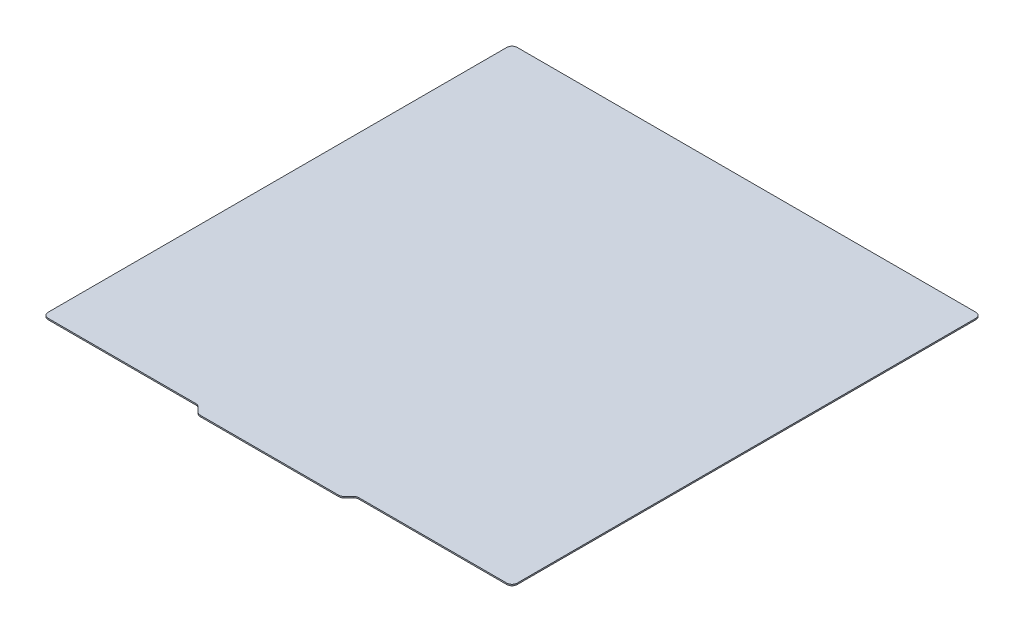
ISO-10303-21;
HEADER;
FILE_DESCRIPTION(('STEP AP214'),'2;1');
FILE_NAME('part.step','',(''),(''),'','','');
FILE_SCHEMA(('AUTOMOTIVE_DESIGN { 1 0 10303 214 1 1 1 1 }'));
ENDSEC;
DATA;
#1=APPLICATION_CONTEXT('core data for automotive mechanical design processes');
#2=APPLICATION_PROTOCOL_DEFINITION('international standard','automotive_design',2000,#1);
#3=PRODUCT_CONTEXT('',#1,'mechanical');
#4=PRODUCT('Part','Part','',(#3));
#5=PRODUCT_RELATED_PRODUCT_CATEGORY('part','',(#4));
#6=PRODUCT_DEFINITION_FORMATION('','',#4);
#7=PRODUCT_DEFINITION_CONTEXT('part definition',#1,'design');
#8=PRODUCT_DEFINITION('design','',#6,#7);
#9=PRODUCT_DEFINITION_SHAPE('','',#8);
#10=(LENGTH_UNIT() NAMED_UNIT(*) SI_UNIT(.MILLI.,.METRE.));
#11=(NAMED_UNIT(*) PLANE_ANGLE_UNIT() SI_UNIT($,.RADIAN.));
#12=(NAMED_UNIT(*) SI_UNIT($,.STERADIAN.) SOLID_ANGLE_UNIT());
#13=UNCERTAINTY_MEASURE_WITH_UNIT(LENGTH_MEASURE(1.E-05),#10,'distance_accuracy_value','');
#14=(GEOMETRIC_REPRESENTATION_CONTEXT(3) GLOBAL_UNCERTAINTY_ASSIGNED_CONTEXT((#13)) GLOBAL_UNIT_ASSIGNED_CONTEXT((#10,
#11,#12)) REPRESENTATION_CONTEXT('',''));
#15=CARTESIAN_POINT('',(0.,0.,0.));
#16=DIRECTION('',(0.,0.,1.));
#17=DIRECTION('',(1.,0.,0.));
#18=AXIS2_PLACEMENT_3D('',#15,#16,#17);
#19=CARTESIAN_POINT('',(60.,1.,177.5));
#20=DIRECTION('',(0.,0.,-1.));
#21=DIRECTION('',(-1.,0.,0.));
#22=AXIS2_PLACEMENT_3D('',#19,#20,#21);
#23=PLANE('',#22);
#24=DIRECTION('',(1.,0.,0.));
#25=VECTOR('',#24,1.);
#26=CARTESIAN_POINT('',(60.,1.,177.5));
#27=LINE('',#26,#25);
#28=CARTESIAN_POINT('',(61.6568542494924,1.,177.5));
#29=VERTEX_POINT('',#28);
#30=CARTESIAN_POINT('',(173.5,1.,177.5));
#31=VERTEX_POINT('',#30);
#32=EDGE_CURVE('E203',#29,#31,#27,.T.);
#33=ORIENTED_EDGE('',*,*,#32,.F.);
#34=DIRECTION('',(0.,-1.,0.));
#35=VECTOR('',#34,1.);
#36=CARTESIAN_POINT('',(61.6568542494924,0.,177.5));
#37=LINE('',#36,#35);
#38=CARTESIAN_POINT('',(61.6568542494924,0.,177.5));
#39=VERTEX_POINT('',#38);
#40=EDGE_CURVE('E254',#29,#39,#37,.T.);
#41=ORIENTED_EDGE('',*,*,#40,.T.);
#42=DIRECTION('',(1.,0.,0.));
#43=VECTOR('',#42,1.);
#44=CARTESIAN_POINT('',(60.,0.,177.5));
#45=LINE('',#44,#43);
#46=CARTESIAN_POINT('',(173.5,0.,177.5));
#47=VERTEX_POINT('',#46);
#48=EDGE_CURVE('E189',#39,#47,#45,.T.);
#49=ORIENTED_EDGE('',*,*,#48,.T.);
#50=DIRECTION('',(0.,-1.,0.));
#51=VECTOR('',#50,1.);
#52=CARTESIAN_POINT('',(173.5,1.,177.5));
#53=LINE('',#52,#51);
#54=EDGE_CURVE('E252',#47,#31,#53,.F.);
#55=ORIENTED_EDGE('',*,*,#54,.T.);
#56=EDGE_LOOP('',(#33,#41,#49,#55));
#57=FACE_BOUND('',#56,.T.);
#58=ADVANCED_FACE('F43',(#57),#23,.F.);
#59=CARTESIAN_POINT('',(177.5,1.,-177.5));
#60=DIRECTION('',(-1.,0.,0.));
#61=DIRECTION('',(0.,0.,1.));
#62=AXIS2_PLACEMENT_3D('',#59,#60,#61);
#63=PLANE('',#62);
#64=DIRECTION('',(0.,0.,-1.));
#65=VECTOR('',#64,1.);
#66=CARTESIAN_POINT('',(177.5,0.,-177.5));
#67=LINE('',#66,#65);
#68=CARTESIAN_POINT('',(177.5,0.,173.5));
#69=VERTEX_POINT('',#68);
#70=CARTESIAN_POINT('',(177.5,0.,-173.5));
#71=VERTEX_POINT('',#70);
#72=EDGE_CURVE('E184',#69,#71,#67,.T.);
#73=ORIENTED_EDGE('',*,*,#72,.T.);
#74=DIRECTION('',(0.,-1.,0.));
#75=VECTOR('',#74,1.);
#76=CARTESIAN_POINT('',(177.5,1.,-173.5));
#77=LINE('',#76,#75);
#78=CARTESIAN_POINT('',(177.5,1.,-173.5));
#79=VERTEX_POINT('',#78);
#80=EDGE_CURVE('E162',#71,#79,#77,.F.);
#81=ORIENTED_EDGE('',*,*,#80,.T.);
#82=DIRECTION('',(0.,0.,-1.));
#83=VECTOR('',#82,1.);
#84=CARTESIAN_POINT('',(177.5,1.,-177.5));
#85=LINE('',#84,#83);
#86=CARTESIAN_POINT('',(177.5,1.,173.5));
#87=VERTEX_POINT('',#86);
#88=EDGE_CURVE('E276',#87,#79,#85,.T.);
#89=ORIENTED_EDGE('',*,*,#88,.F.);
#90=DIRECTION('',(0.,-1.,0.));
#91=VECTOR('',#90,1.);
#92=CARTESIAN_POINT('',(177.5,1.,173.5));
#93=LINE('',#92,#91);
#94=EDGE_CURVE('E167',#87,#69,#93,.T.);
#95=ORIENTED_EDGE('',*,*,#94,.T.);
#96=EDGE_LOOP('',(#73,#81,#89,#95));
#97=FACE_BOUND('',#96,.T.);
#98=ADVANCED_FACE('F296',(#97),#63,.F.);
#99=CARTESIAN_POINT('',(-177.5,1.,-177.5));
#100=DIRECTION('',(0.,0.,1.));
#101=DIRECTION('',(1.,0.,0.));
#102=AXIS2_PLACEMENT_3D('',#99,#100,#101);
#103=PLANE('',#102);
#104=DIRECTION('',(-1.,0.,0.));
#105=VECTOR('',#104,1.);
#106=CARTESIAN_POINT('',(-177.5,1.,-177.5));
#107=LINE('',#106,#105);
#108=CARTESIAN_POINT('',(173.5,1.,-177.5));
#109=VERTEX_POINT('',#108);
#110=CARTESIAN_POINT('',(-173.5,1.,-177.5));
#111=VERTEX_POINT('',#110);
#112=EDGE_CURVE('E177',#109,#111,#107,.T.);
#113=ORIENTED_EDGE('',*,*,#112,.F.);
#114=DIRECTION('',(0.,-1.,0.));
#115=VECTOR('',#114,1.);
#116=CARTESIAN_POINT('',(173.5,1.,-177.5));
#117=LINE('',#116,#115);
#118=CARTESIAN_POINT('',(173.5,0.,-177.5));
#119=VERTEX_POINT('',#118);
#120=EDGE_CURVE('E161',#109,#119,#117,.T.);
#121=ORIENTED_EDGE('',*,*,#120,.T.);
#122=DIRECTION('',(-1.,0.,0.));
#123=VECTOR('',#122,1.);
#124=CARTESIAN_POINT('',(-177.5,0.,-177.5));
#125=LINE('',#124,#123);
#126=CARTESIAN_POINT('',(-173.5,0.,-177.5));
#127=VERTEX_POINT('',#126);
#128=EDGE_CURVE('E174',#119,#127,#125,.T.);
#129=ORIENTED_EDGE('',*,*,#128,.T.);
#130=DIRECTION('',(0.,-1.,0.));
#131=VECTOR('',#130,1.);
#132=CARTESIAN_POINT('',(-173.5,1.,-177.5));
#133=LINE('',#132,#131);
#134=EDGE_CURVE('E179',#127,#111,#133,.F.);
#135=ORIENTED_EDGE('',*,*,#134,.T.);
#136=EDGE_LOOP('',(#113,#121,#129,#135));
#137=FACE_BOUND('',#136,.T.);
#138=ADVANCED_FACE('F173',(#137),#103,.F.);
#139=CARTESIAN_POINT('',(-177.5,1.,-177.5));
#140=DIRECTION('',(1.,0.,0.));
#141=DIRECTION('',(0.,0.,-1.));
#142=AXIS2_PLACEMENT_3D('',#139,#140,#141);
#143=PLANE('',#142);
#144=DIRECTION('',(0.,0.,1.));
#145=VECTOR('',#144,1.);
#146=CARTESIAN_POINT('',(-177.5,1.,-177.5));
#147=LINE('',#146,#145);
#148=CARTESIAN_POINT('',(-177.5,1.,-173.5));
#149=VERTEX_POINT('',#148);
#150=CARTESIAN_POINT('',(-177.5,1.,173.5));
#151=VERTEX_POINT('',#150);
#152=EDGE_CURVE('E281',#149,#151,#147,.T.);
#153=ORIENTED_EDGE('',*,*,#152,.F.);
#154=DIRECTION('',(0.,-1.,0.));
#155=VECTOR('',#154,1.);
#156=CARTESIAN_POINT('',(-177.5,1.,-173.5));
#157=LINE('',#156,#155);
#158=CARTESIAN_POINT('',(-177.5,0.,-173.5));
#159=VERTEX_POINT('',#158);
#160=EDGE_CURVE('E230',#149,#159,#157,.T.);
#161=ORIENTED_EDGE('',*,*,#160,.T.);
#162=DIRECTION('',(0.,0.,1.));
#163=VECTOR('',#162,1.);
#164=CARTESIAN_POINT('',(-177.5,0.,-177.5));
#165=LINE('',#164,#163);
#166=CARTESIAN_POINT('',(-177.5,0.,173.5));
#167=VERTEX_POINT('',#166);
#168=EDGE_CURVE('E183',#159,#167,#165,.T.);
#169=ORIENTED_EDGE('',*,*,#168,.T.);
#170=DIRECTION('',(0.,-1.,0.));
#171=VECTOR('',#170,1.);
#172=CARTESIAN_POINT('',(-177.5,1.,173.5));
#173=LINE('',#172,#171);
#174=EDGE_CURVE('E228',#167,#151,#173,.F.);
#175=ORIENTED_EDGE('',*,*,#174,.T.);
#176=EDGE_LOOP('',(#153,#161,#169,#175));
#177=FACE_BOUND('',#176,.T.);
#178=ADVANCED_FACE('F303',(#177),#143,.F.);
#179=CARTESIAN_POINT('',(-177.5,1.,177.5));
#180=DIRECTION('',(0.,0.,-1.));
#181=DIRECTION('',(-1.,0.,0.));
#182=AXIS2_PLACEMENT_3D('',#179,#180,#181);
#183=PLANE('',#182);
#184=DIRECTION('',(1.,0.,0.));
#185=VECTOR('',#184,1.);
#186=CARTESIAN_POINT('',(-177.5,1.,177.5));
#187=LINE('',#186,#185);
#188=CARTESIAN_POINT('',(-173.5,1.,177.5));
#189=VERTEX_POINT('',#188);
#190=CARTESIAN_POINT('',(-61.6568542494924,1.,177.5));
#191=VERTEX_POINT('',#190);
#192=EDGE_CURVE('E284',#189,#191,#187,.T.);
#193=ORIENTED_EDGE('',*,*,#192,.F.);
#194=DIRECTION('',(0.,-1.,0.));
#195=VECTOR('',#194,1.);
#196=CARTESIAN_POINT('',(-173.5,1.,177.5));
#197=LINE('',#196,#195);
#198=CARTESIAN_POINT('',(-173.5,0.,177.5));
#199=VERTEX_POINT('',#198);
#200=EDGE_CURVE('E235',#189,#199,#197,.T.);
#201=ORIENTED_EDGE('',*,*,#200,.T.);
#202=DIRECTION('',(1.,0.,0.));
#203=VECTOR('',#202,1.);
#204=CARTESIAN_POINT('',(-177.5,0.,177.5));
#205=LINE('',#204,#203);
#206=CARTESIAN_POINT('',(-61.6568542494924,0.,177.5));
#207=VERTEX_POINT('',#206);
#208=EDGE_CURVE('E187',#199,#207,#205,.T.);
#209=ORIENTED_EDGE('',*,*,#208,.T.);
#210=DIRECTION('',(0.,-1.,0.));
#211=VECTOR('',#210,1.);
#212=CARTESIAN_POINT('',(-61.6568542494924,1.,177.5));
#213=LINE('',#212,#211);
#214=EDGE_CURVE('E233',#207,#191,#213,.F.);
#215=ORIENTED_EDGE('',*,*,#214,.T.);
#216=EDGE_LOOP('',(#193,#201,#209,#215));
#217=FACE_BOUND('',#216,.T.);
#218=ADVANCED_FACE('F422',(#217),#183,.F.);
#219=CARTESIAN_POINT('',(-60.,1.,177.5));
#220=DIRECTION('',(0.707106781186548,0.,-0.707106781186547));
#221=DIRECTION('',(-0.707106781186547,0.,-0.707106781186548));
#222=AXIS2_PLACEMENT_3D('',#219,#220,#221);
#223=PLANE('',#222);
#224=DIRECTION('',(0.707106781186547,0.,0.707106781186548));
#225=VECTOR('',#224,1.);
#226=CARTESIAN_POINT('',(-60.,0.,177.5));
#227=LINE('',#226,#225);
#228=CARTESIAN_POINT('',(-58.8284271247462,0.,178.671572875254));
#229=VERTEX_POINT('',#228);
#230=CARTESIAN_POINT('',(-55.1715728752538,0.,182.328427124746));
#231=VERTEX_POINT('',#230);
#232=EDGE_CURVE('E195',#229,#231,#227,.T.);
#233=ORIENTED_EDGE('',*,*,#232,.T.);
#234=DIRECTION('',(0.,-1.,0.));
#235=VECTOR('',#234,1.);
#236=CARTESIAN_POINT('',(-55.1715728752538,1.,182.328427124746));
#237=LINE('',#236,#235);
#238=CARTESIAN_POINT('',(-55.1715728752538,1.,182.328427124746));
#239=VERTEX_POINT('',#238);
#240=EDGE_CURVE('E246',#231,#239,#237,.F.);
#241=ORIENTED_EDGE('',*,*,#240,.T.);
#242=DIRECTION('',(0.707106781186547,0.,0.707106781186548));
#243=VECTOR('',#242,1.);
#244=CARTESIAN_POINT('',(-60.,1.,177.5));
#245=LINE('',#244,#243);
#246=CARTESIAN_POINT('',(-58.8284271247462,1.,178.671572875254));
#247=VERTEX_POINT('',#246);
#248=EDGE_CURVE('E287',#247,#239,#245,.T.);
#249=ORIENTED_EDGE('',*,*,#248,.F.);
#250=DIRECTION('',(0.,-1.,0.));
#251=VECTOR('',#250,1.);
#252=CARTESIAN_POINT('',(-58.8284271247462,0.,178.671572875254));
#253=LINE('',#252,#251);
#254=EDGE_CURVE('E243',#247,#229,#253,.T.);
#255=ORIENTED_EDGE('',*,*,#254,.T.);
#256=EDGE_LOOP('',(#233,#241,#249,#255));
#257=FACE_BOUND('',#256,.T.);
#258=ADVANCED_FACE('F412',(#257),#223,.F.);
#259=CARTESIAN_POINT('',(-54.,1.,183.5));
#260=DIRECTION('',(0.,0.,-1.));
#261=DIRECTION('',(-1.,0.,0.));
#262=AXIS2_PLACEMENT_3D('',#259,#260,#261);
#263=PLANE('',#262);
#264=DIRECTION('',(1.,0.,0.));
#265=VECTOR('',#264,1.);
#266=CARTESIAN_POINT('',(-54.,1.,183.5));
#267=LINE('',#266,#265);
#268=CARTESIAN_POINT('',(-52.3431457505076,1.,183.5));
#269=VERTEX_POINT('',#268);
#270=CARTESIAN_POINT('',(52.3431457505076,1.,183.5));
#271=VERTEX_POINT('',#270);
#272=EDGE_CURVE('E290',#269,#271,#267,.T.);
#273=ORIENTED_EDGE('',*,*,#272,.F.);
#274=DIRECTION('',(0.,-1.,0.));
#275=VECTOR('',#274,1.);
#276=CARTESIAN_POINT('',(-52.3431457505076,1.,183.5));
#277=LINE('',#276,#275);
#278=CARTESIAN_POINT('',(-52.3431457505076,0.,183.5));
#279=VERTEX_POINT('',#278);
#280=EDGE_CURVE('E240',#269,#279,#277,.T.);
#281=ORIENTED_EDGE('',*,*,#280,.T.);
#282=DIRECTION('',(1.,0.,0.));
#283=VECTOR('',#282,1.);
#284=CARTESIAN_POINT('',(-54.,0.,183.5));
#285=LINE('',#284,#283);
#286=CARTESIAN_POINT('',(52.3431457505076,0.,183.5));
#287=VERTEX_POINT('',#286);
#288=EDGE_CURVE('E198',#279,#287,#285,.T.);
#289=ORIENTED_EDGE('',*,*,#288,.T.);
#290=DIRECTION('',(0.,-1.,0.));
#291=VECTOR('',#290,1.);
#292=CARTESIAN_POINT('',(52.3431457505076,1.,183.5));
#293=LINE('',#292,#291);
#294=EDGE_CURVE('E238',#287,#271,#293,.F.);
#295=ORIENTED_EDGE('',*,*,#294,.T.);
#296=EDGE_LOOP('',(#273,#281,#289,#295));
#297=FACE_BOUND('',#296,.T.);
#298=ADVANCED_FACE('F403',(#297),#263,.F.);
#299=CARTESIAN_POINT('',(54.,1.,183.5));
#300=DIRECTION('',(-0.707106781186548,0.,-0.707106781186547));
#301=DIRECTION('',(-0.707106781186547,0.,0.707106781186548));
#302=AXIS2_PLACEMENT_3D('',#299,#300,#301);
#303=PLANE('',#302);
#304=DIRECTION('',(0.707106781186547,0.,-0.707106781186548));
#305=VECTOR('',#304,1.);
#306=CARTESIAN_POINT('',(54.,1.,183.5));
#307=LINE('',#306,#305);
#308=CARTESIAN_POINT('',(55.1715728752538,1.,182.328427124746));
#309=VERTEX_POINT('',#308);
#310=CARTESIAN_POINT('',(58.8284271247462,1.,178.671572875254));
#311=VERTEX_POINT('',#310);
#312=EDGE_CURVE('E204',#309,#311,#307,.T.);
#313=ORIENTED_EDGE('',*,*,#312,.F.);
#314=DIRECTION('',(0.,-1.,0.));
#315=VECTOR('',#314,1.);
#316=CARTESIAN_POINT('',(55.1715728752538,1.,182.328427124746));
#317=LINE('',#316,#315);
#318=CARTESIAN_POINT('',(55.1715728752538,0.,182.328427124746));
#319=VERTEX_POINT('',#318);
#320=EDGE_CURVE('E249',#309,#319,#317,.T.);
#321=ORIENTED_EDGE('',*,*,#320,.T.);
#322=DIRECTION('',(0.707106781186547,0.,-0.707106781186548));
#323=VECTOR('',#322,1.);
#324=CARTESIAN_POINT('',(54.,0.,183.5));
#325=LINE('',#324,#323);
#326=CARTESIAN_POINT('',(58.8284271247462,0.,178.671572875254));
#327=VERTEX_POINT('',#326);
#328=EDGE_CURVE('E201',#319,#327,#325,.T.);
#329=ORIENTED_EDGE('',*,*,#328,.T.);
#330=DIRECTION('',(0.,-1.,0.));
#331=VECTOR('',#330,1.);
#332=CARTESIAN_POINT('',(58.8284271247462,1.,178.671572875254));
#333=LINE('',#332,#331);
#334=EDGE_CURVE('E58',#327,#311,#333,.F.);
#335=ORIENTED_EDGE('',*,*,#334,.T.);
#336=EDGE_LOOP('',(#313,#321,#329,#335));
#337=FACE_BOUND('',#336,.T.);
#338=ADVANCED_FACE('F265',(#337),#303,.F.);
#339=CARTESIAN_POINT('',(0.,1.,0.));
#340=DIRECTION('',(0.,-1.,0.));
#341=DIRECTION('',(0.,0.,-1.));
#342=AXIS2_PLACEMENT_3D('',#339,#340,#341);
#343=PLANE('',#342);
#344=ORIENTED_EDGE('',*,*,#88,.T.);
#345=CARTESIAN_POINT('',(173.5,1.,-173.5));
#346=DIRECTION('',(0.,-1.,0.));
#347=DIRECTION('',(0.,0.,-1.));
#348=AXIS2_PLACEMENT_3D('',#345,#346,#347);
#349=CIRCLE('',#348,4.);
#350=EDGE_CURVE('E226',#79,#109,#349,.F.);
#351=ORIENTED_EDGE('',*,*,#350,.T.);
#352=ORIENTED_EDGE('',*,*,#112,.T.);
#353=CARTESIAN_POINT('',(-173.5,1.,-173.5));
#354=DIRECTION('',(0.,-1.,0.));
#355=DIRECTION('',(0.,0.,-1.));
#356=AXIS2_PLACEMENT_3D('',#353,#354,#355);
#357=CIRCLE('',#356,4.);
#358=EDGE_CURVE('E224',#111,#149,#357,.F.);
#359=ORIENTED_EDGE('',*,*,#358,.T.);
#360=ORIENTED_EDGE('',*,*,#152,.T.);
#361=CARTESIAN_POINT('',(-173.5,1.,173.5));
#362=DIRECTION('',(0.,-1.,0.));
#363=DIRECTION('',(0.,0.,-1.));
#364=AXIS2_PLACEMENT_3D('',#361,#362,#363);
#365=CIRCLE('',#364,4.);
#366=EDGE_CURVE('E222',#151,#189,#365,.F.);
#367=ORIENTED_EDGE('',*,*,#366,.T.);
#368=ORIENTED_EDGE('',*,*,#192,.T.);
#369=CARTESIAN_POINT('',(-61.6568542494924,1.,181.5));
#370=DIRECTION('',(0.,-1.,0.));
#371=DIRECTION('',(0.,0.,-1.));
#372=AXIS2_PLACEMENT_3D('',#369,#370,#371);
#373=CIRCLE('',#372,4.);
#374=EDGE_CURVE('E259',#191,#247,#373,.T.);
#375=ORIENTED_EDGE('',*,*,#374,.T.);
#376=ORIENTED_EDGE('',*,*,#248,.T.);
#377=CARTESIAN_POINT('',(-52.3431457505076,1.,179.5));
#378=DIRECTION('',(0.,-1.,0.));
#379=DIRECTION('',(0.,0.,-1.));
#380=AXIS2_PLACEMENT_3D('',#377,#378,#379);
#381=CIRCLE('',#380,4.);
#382=EDGE_CURVE('E220',#239,#269,#381,.F.);
#383=ORIENTED_EDGE('',*,*,#382,.T.);
#384=ORIENTED_EDGE('',*,*,#272,.T.);
#385=CARTESIAN_POINT('',(52.3431457505076,1.,179.5));
#386=DIRECTION('',(0.,-1.,0.));
#387=DIRECTION('',(0.,0.,-1.));
#388=AXIS2_PLACEMENT_3D('',#385,#386,#387);
#389=CIRCLE('',#388,4.);
#390=EDGE_CURVE('E65',#271,#309,#389,.F.);
#391=ORIENTED_EDGE('',*,*,#390,.T.);
#392=ORIENTED_EDGE('',*,*,#312,.T.);
#393=CARTESIAN_POINT('',(61.6568542494924,1.,181.5));
#394=DIRECTION('',(0.,-1.,0.));
#395=DIRECTION('',(0.,0.,-1.));
#396=AXIS2_PLACEMENT_3D('',#393,#394,#395);
#397=CIRCLE('',#396,4.);
#398=EDGE_CURVE('E11',#311,#29,#397,.T.);
#399=ORIENTED_EDGE('',*,*,#398,.T.);
#400=ORIENTED_EDGE('',*,*,#32,.T.);
#401=CARTESIAN_POINT('',(173.5,1.,173.5));
#402=DIRECTION('',(0.,-1.,0.));
#403=DIRECTION('',(0.,0.,-1.));
#404=AXIS2_PLACEMENT_3D('',#401,#402,#403);
#405=CIRCLE('',#404,4.);
#406=EDGE_CURVE('E217',#31,#87,#405,.F.);
#407=ORIENTED_EDGE('',*,*,#406,.T.);
#408=EDGE_LOOP('',(#344,#351,#352,#359,#360,#367,#368,#375,#376,#383,#384,#391,#392,#399,#400,#407));
#409=FACE_BOUND('',#408,.T.);
#410=ADVANCED_FACE('F272',(#409),#343,.F.);
#411=CARTESIAN_POINT('',(0.,0.,0.));
#412=DIRECTION('',(0.,-1.,0.));
#413=DIRECTION('',(0.,0.,-1.));
#414=AXIS2_PLACEMENT_3D('',#411,#412,#413);
#415=PLANE('',#414);
#416=ORIENTED_EDGE('',*,*,#128,.F.);
#417=CARTESIAN_POINT('',(173.5,0.,-173.5));
#418=DIRECTION('',(0.,-1.,0.));
#419=DIRECTION('',(0.,0.,-1.));
#420=AXIS2_PLACEMENT_3D('',#417,#418,#419);
#421=CIRCLE('',#420,4.);
#422=EDGE_CURVE('E157',#119,#71,#421,.T.);
#423=ORIENTED_EDGE('',*,*,#422,.T.);
#424=ORIENTED_EDGE('',*,*,#72,.F.);
#425=CARTESIAN_POINT('',(173.5,0.,173.5));
#426=DIRECTION('',(0.,-1.,0.));
#427=DIRECTION('',(0.,0.,-1.));
#428=AXIS2_PLACEMENT_3D('',#425,#426,#427);
#429=CIRCLE('',#428,4.);
#430=EDGE_CURVE('E178',#69,#47,#429,.T.);
#431=ORIENTED_EDGE('',*,*,#430,.T.);
#432=ORIENTED_EDGE('',*,*,#48,.F.);
#433=CARTESIAN_POINT('',(61.6568542494924,0.,181.5));
#434=DIRECTION('',(0.,-1.,0.));
#435=DIRECTION('',(0.,0.,-1.));
#436=AXIS2_PLACEMENT_3D('',#433,#434,#435);
#437=CIRCLE('',#436,4.);
#438=EDGE_CURVE('E51',#39,#327,#437,.F.);
#439=ORIENTED_EDGE('',*,*,#438,.T.);
#440=ORIENTED_EDGE('',*,*,#328,.F.);
#441=CARTESIAN_POINT('',(52.3431457505076,0.,179.5));
#442=DIRECTION('',(0.,-1.,0.));
#443=DIRECTION('',(0.,0.,-1.));
#444=AXIS2_PLACEMENT_3D('',#441,#442,#443);
#445=CIRCLE('',#444,4.);
#446=EDGE_CURVE('E207',#319,#287,#445,.T.);
#447=ORIENTED_EDGE('',*,*,#446,.T.);
#448=ORIENTED_EDGE('',*,*,#288,.F.);
#449=CARTESIAN_POINT('',(-52.3431457505076,0.,179.5));
#450=DIRECTION('',(0.,-1.,0.));
#451=DIRECTION('',(0.,0.,-1.));
#452=AXIS2_PLACEMENT_3D('',#449,#450,#451);
#453=CIRCLE('',#452,4.);
#454=EDGE_CURVE('E209',#279,#231,#453,.T.);
#455=ORIENTED_EDGE('',*,*,#454,.T.);
#456=ORIENTED_EDGE('',*,*,#232,.F.);
#457=CARTESIAN_POINT('',(-61.6568542494924,0.,181.5));
#458=DIRECTION('',(0.,-1.,0.));
#459=DIRECTION('',(0.,0.,-1.));
#460=AXIS2_PLACEMENT_3D('',#457,#458,#459);
#461=CIRCLE('',#460,4.);
#462=EDGE_CURVE('E257',#229,#207,#461,.F.);
#463=ORIENTED_EDGE('',*,*,#462,.T.);
#464=ORIENTED_EDGE('',*,*,#208,.F.);
#465=CARTESIAN_POINT('',(-173.5,0.,173.5));
#466=DIRECTION('',(0.,-1.,0.));
#467=DIRECTION('',(0.,0.,-1.));
#468=AXIS2_PLACEMENT_3D('',#465,#466,#467);
#469=CIRCLE('',#468,4.);
#470=EDGE_CURVE('E211',#199,#167,#469,.T.);
#471=ORIENTED_EDGE('',*,*,#470,.T.);
#472=ORIENTED_EDGE('',*,*,#168,.F.);
#473=CARTESIAN_POINT('',(-173.5,0.,-173.5));
#474=DIRECTION('',(0.,-1.,0.));
#475=DIRECTION('',(0.,0.,-1.));
#476=AXIS2_PLACEMENT_3D('',#473,#474,#475);
#477=CIRCLE('',#476,4.);
#478=EDGE_CURVE('E168',#159,#127,#477,.T.);
#479=ORIENTED_EDGE('',*,*,#478,.T.);
#480=EDGE_LOOP('',(#416,#423,#424,#431,#432,#439,#440,#447,#448,#455,#456,#463,#464,#471,#472,#479));
#481=FACE_BOUND('',#480,.T.);
#482=ADVANCED_FACE('F181',(#481),#415,.T.);
#483=CARTESIAN_POINT('',(173.5,1.,-173.5));
#484=DIRECTION('',(0.,-1.,0.));
#485=DIRECTION('',(0.,0.,-1.));
#486=AXIS2_PLACEMENT_3D('',#483,#484,#485);
#487=CYLINDRICAL_SURFACE('',#486,4.);
#488=ORIENTED_EDGE('',*,*,#350,.F.);
#489=ORIENTED_EDGE('',*,*,#80,.F.);
#490=ORIENTED_EDGE('',*,*,#422,.F.);
#491=ORIENTED_EDGE('',*,*,#120,.F.);
#492=EDGE_LOOP('',(#488,#489,#490,#491));
#493=FACE_BOUND('',#492,.T.);
#494=ADVANCED_FACE('F160',(#493),#487,.T.);
#495=CARTESIAN_POINT('',(-173.5,1.,-173.5));
#496=DIRECTION('',(0.,-1.,0.));
#497=DIRECTION('',(0.,0.,-1.));
#498=AXIS2_PLACEMENT_3D('',#495,#496,#497);
#499=CYLINDRICAL_SURFACE('',#498,4.);
#500=ORIENTED_EDGE('',*,*,#358,.F.);
#501=ORIENTED_EDGE('',*,*,#134,.F.);
#502=ORIENTED_EDGE('',*,*,#478,.F.);
#503=ORIENTED_EDGE('',*,*,#160,.F.);
#504=EDGE_LOOP('',(#500,#501,#502,#503));
#505=FACE_BOUND('',#504,.T.);
#506=ADVANCED_FACE('F310',(#505),#499,.T.);
#507=CARTESIAN_POINT('',(-173.5,1.,173.5));
#508=DIRECTION('',(0.,-1.,0.));
#509=DIRECTION('',(0.,0.,-1.));
#510=AXIS2_PLACEMENT_3D('',#507,#508,#509);
#511=CYLINDRICAL_SURFACE('',#510,4.);
#512=ORIENTED_EDGE('',*,*,#366,.F.);
#513=ORIENTED_EDGE('',*,*,#174,.F.);
#514=ORIENTED_EDGE('',*,*,#470,.F.);
#515=ORIENTED_EDGE('',*,*,#200,.F.);
#516=EDGE_LOOP('',(#512,#513,#514,#515));
#517=FACE_BOUND('',#516,.T.);
#518=ADVANCED_FACE('F313',(#517),#511,.T.);
#519=CARTESIAN_POINT('',(-52.3431457505076,1.,179.5));
#520=DIRECTION('',(0.,-1.,0.));
#521=DIRECTION('',(0.,0.,-1.));
#522=AXIS2_PLACEMENT_3D('',#519,#520,#521);
#523=CYLINDRICAL_SURFACE('',#522,4.);
#524=ORIENTED_EDGE('',*,*,#382,.F.);
#525=ORIENTED_EDGE('',*,*,#240,.F.);
#526=ORIENTED_EDGE('',*,*,#454,.F.);
#527=ORIENTED_EDGE('',*,*,#280,.F.);
#528=EDGE_LOOP('',(#524,#525,#526,#527));
#529=FACE_BOUND('',#528,.T.);
#530=ADVANCED_FACE('F317',(#529),#523,.T.);
#531=CARTESIAN_POINT('',(-61.6568542494924,1.,181.5));
#532=DIRECTION('',(0.,1.,0.));
#533=DIRECTION('',(0.,0.,1.));
#534=AXIS2_PLACEMENT_3D('',#531,#532,#533);
#535=CYLINDRICAL_SURFACE('',#534,4.);
#536=ORIENTED_EDGE('',*,*,#374,.F.);
#537=ORIENTED_EDGE('',*,*,#214,.F.);
#538=ORIENTED_EDGE('',*,*,#462,.F.);
#539=ORIENTED_EDGE('',*,*,#254,.F.);
#540=EDGE_LOOP('',(#536,#537,#538,#539));
#541=FACE_BOUND('',#540,.T.);
#542=ADVANCED_FACE('F321',(#541),#535,.F.);
#543=CARTESIAN_POINT('',(52.3431457505076,1.,179.5));
#544=DIRECTION('',(0.,-1.,0.));
#545=DIRECTION('',(0.,0.,-1.));
#546=AXIS2_PLACEMENT_3D('',#543,#544,#545);
#547=CYLINDRICAL_SURFACE('',#546,4.);
#548=ORIENTED_EDGE('',*,*,#390,.F.);
#549=ORIENTED_EDGE('',*,*,#294,.F.);
#550=ORIENTED_EDGE('',*,*,#446,.F.);
#551=ORIENTED_EDGE('',*,*,#320,.F.);
#552=EDGE_LOOP('',(#548,#549,#550,#551));
#553=FACE_BOUND('',#552,.T.);
#554=ADVANCED_FACE('F325',(#553),#547,.T.);
#555=CARTESIAN_POINT('',(61.6568542494924,1.,181.5));
#556=DIRECTION('',(0.,1.,0.));
#557=DIRECTION('',(0.,0.,1.));
#558=AXIS2_PLACEMENT_3D('',#555,#556,#557);
#559=CYLINDRICAL_SURFACE('',#558,4.);
#560=ORIENTED_EDGE('',*,*,#398,.F.);
#561=ORIENTED_EDGE('',*,*,#334,.F.);
#562=ORIENTED_EDGE('',*,*,#438,.F.);
#563=ORIENTED_EDGE('',*,*,#40,.F.);
#564=EDGE_LOOP('',(#560,#561,#562,#563));
#565=FACE_BOUND('',#564,.T.);
#566=ADVANCED_FACE('F268',(#565),#559,.F.);
#567=CARTESIAN_POINT('',(173.5,1.,173.5));
#568=DIRECTION('',(0.,-1.,0.));
#569=DIRECTION('',(0.,0.,-1.));
#570=AXIS2_PLACEMENT_3D('',#567,#568,#569);
#571=CYLINDRICAL_SURFACE('',#570,4.);
#572=ORIENTED_EDGE('',*,*,#406,.F.);
#573=ORIENTED_EDGE('',*,*,#54,.F.);
#574=ORIENTED_EDGE('',*,*,#430,.F.);
#575=ORIENTED_EDGE('',*,*,#94,.F.);
#576=EDGE_LOOP('',(#572,#573,#574,#575));
#577=FACE_BOUND('',#576,.T.);
#578=ADVANCED_FACE('F45',(#577),#571,.T.);
#579=CLOSED_SHELL('',(#58,#98,#138,#178,#218,#258,#298,#338,#410,#482,#494,#506,#518,#530,#542,
#554,#566,#578));
#580=MANIFOLD_SOLID_BREP('B2',#579);
#581=ADVANCED_BREP_SHAPE_REPRESENTATION('',(#18,#580),#14);
#582=SHAPE_DEFINITION_REPRESENTATION(#9,#581);
ENDSEC;
END-ISO-10303-21;
